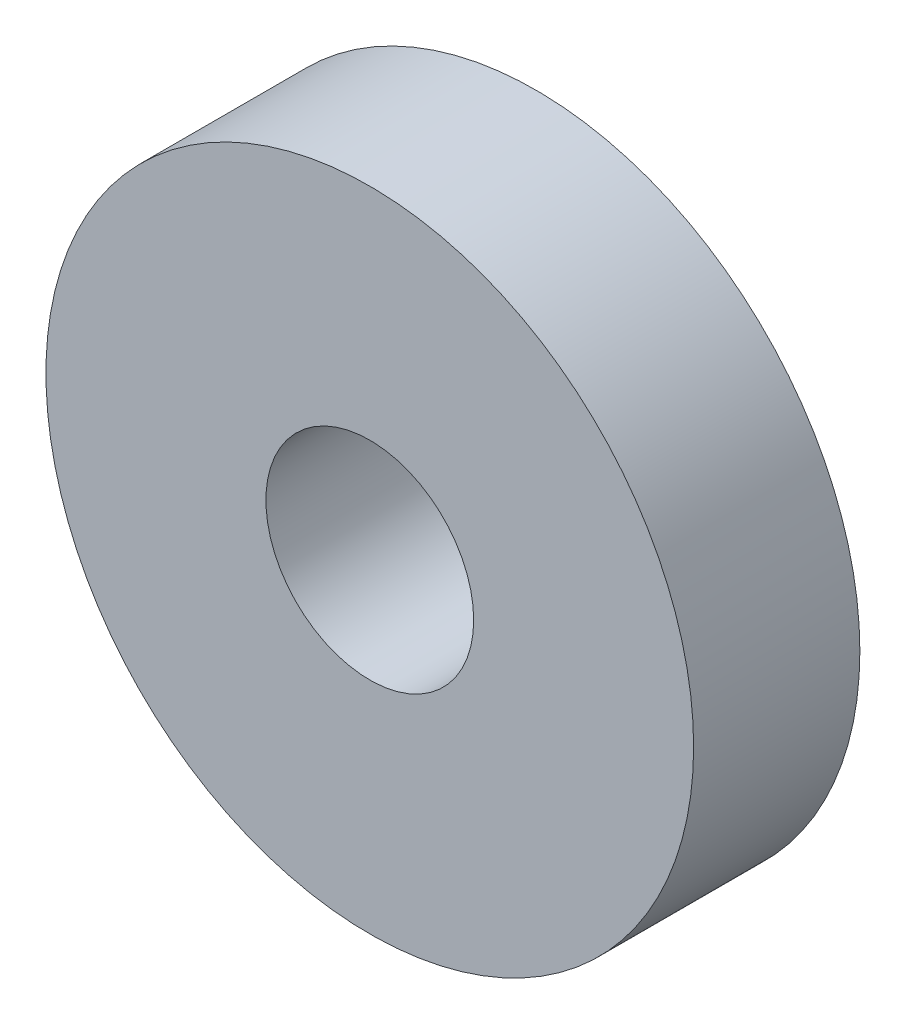
ISO-10303-21;
HEADER;
FILE_DESCRIPTION(('STEP AP214'),'2;1');
FILE_NAME('part.step','',(''),(''),'','','');
FILE_SCHEMA(('AUTOMOTIVE_DESIGN { 1 0 10303 214 1 1 1 1 }'));
ENDSEC;
DATA;
#1=APPLICATION_CONTEXT('core data for automotive mechanical design processes');
#2=APPLICATION_PROTOCOL_DEFINITION('international standard','automotive_design',2000,#1);
#3=PRODUCT_CONTEXT('',#1,'mechanical');
#4=PRODUCT('Part','Part','',(#3));
#5=PRODUCT_RELATED_PRODUCT_CATEGORY('part','',(#4));
#6=PRODUCT_DEFINITION_FORMATION('','',#4);
#7=PRODUCT_DEFINITION_CONTEXT('part definition',#1,'design');
#8=PRODUCT_DEFINITION('design','',#6,#7);
#9=PRODUCT_DEFINITION_SHAPE('','',#8);
#10=(LENGTH_UNIT() NAMED_UNIT(*) SI_UNIT(.MILLI.,.METRE.));
#11=(NAMED_UNIT(*) PLANE_ANGLE_UNIT() SI_UNIT($,.RADIAN.));
#12=(NAMED_UNIT(*) SI_UNIT($,.STERADIAN.) SOLID_ANGLE_UNIT());
#13=UNCERTAINTY_MEASURE_WITH_UNIT(LENGTH_MEASURE(1.E-05),#10,'distance_accuracy_value','');
#14=(GEOMETRIC_REPRESENTATION_CONTEXT(3) GLOBAL_UNCERTAINTY_ASSIGNED_CONTEXT((#13)) GLOBAL_UNIT_ASSIGNED_CONTEXT((#10,
#11,#12)) REPRESENTATION_CONTEXT('',''));
#15=CARTESIAN_POINT('',(0.,0.,0.));
#16=DIRECTION('',(0.,0.,1.));
#17=DIRECTION('',(1.,0.,0.));
#18=AXIS2_PLACEMENT_3D('',#15,#16,#17);
#19=CARTESIAN_POINT('',(0.,0.,20.));
#20=DIRECTION('',(0.,0.,1.));
#21=DIRECTION('',(1.,0.,0.));
#22=AXIS2_PLACEMENT_3D('',#19,#20,#21);
#23=PLANE('',#22);
#24=CARTESIAN_POINT('',(0.,0.,20.));
#25=DIRECTION('',(0.,0.,1.));
#26=DIRECTION('',(1.,0.,0.));
#27=AXIS2_PLACEMENT_3D('',#24,#25,#26);
#28=CIRCLE('',#27,38.9636);
#29=CARTESIAN_POINT('',(38.9636,0.,20.));
#30=VERTEX_POINT('',#29);
#31=EDGE_CURVE('E10',#30,#30,#28,.T.);
#32=ORIENTED_EDGE('',*,*,#31,.T.);
#33=EDGE_LOOP('',(#32));
#34=FACE_BOUND('',#33,.T.);
#35=CARTESIAN_POINT('',(0.,0.,20.));
#36=DIRECTION('',(0.,0.,1.));
#37=DIRECTION('',(1.,0.,0.));
#38=AXIS2_PLACEMENT_3D('',#35,#36,#37);
#39=CIRCLE('',#38,12.5);
#40=CARTESIAN_POINT('',(12.5,0.,20.));
#41=VERTEX_POINT('',#40);
#42=EDGE_CURVE('E41',#41,#41,#39,.T.);
#43=ORIENTED_EDGE('',*,*,#42,.F.);
#44=EDGE_LOOP('',(#43));
#45=FACE_BOUND('',#44,.T.);
#46=ADVANCED_FACE('F30',(#34,#45),#23,.T.);
#47=CARTESIAN_POINT('',(0.,0.,0.));
#48=DIRECTION('',(0.,0.,1.));
#49=DIRECTION('',(1.,0.,0.));
#50=AXIS2_PLACEMENT_3D('',#47,#48,#49);
#51=PLANE('',#50);
#52=CARTESIAN_POINT('',(0.,0.,0.));
#53=DIRECTION('',(0.,0.,1.));
#54=DIRECTION('',(1.,0.,0.));
#55=AXIS2_PLACEMENT_3D('',#52,#53,#54);
#56=CIRCLE('',#55,38.9636);
#57=CARTESIAN_POINT('',(38.9636,0.,0.));
#58=VERTEX_POINT('',#57);
#59=EDGE_CURVE('E34',#58,#58,#56,.T.);
#60=ORIENTED_EDGE('',*,*,#59,.F.);
#61=EDGE_LOOP('',(#60));
#62=FACE_BOUND('',#61,.T.);
#63=CARTESIAN_POINT('',(0.,0.,0.));
#64=DIRECTION('',(0.,0.,1.));
#65=DIRECTION('',(1.,0.,0.));
#66=AXIS2_PLACEMENT_3D('',#63,#64,#65);
#67=CIRCLE('',#66,12.5);
#68=CARTESIAN_POINT('',(12.5,0.,0.));
#69=VERTEX_POINT('',#68);
#70=EDGE_CURVE('E43',#69,#69,#67,.T.);
#71=ORIENTED_EDGE('',*,*,#70,.T.);
#72=EDGE_LOOP('',(#71));
#73=FACE_BOUND('',#72,.T.);
#74=ADVANCED_FACE('F53',(#62,#73),#51,.F.);
#75=CARTESIAN_POINT('',(0.,0.,20.));
#76=DIRECTION('',(0.,0.,-1.));
#77=DIRECTION('',(-1.,0.,0.));
#78=AXIS2_PLACEMENT_3D('',#75,#76,#77);
#79=CYLINDRICAL_SURFACE('',#78,38.9636);
#80=ORIENTED_EDGE('',*,*,#31,.F.);
#81=EDGE_LOOP('',(#80));
#82=FACE_BOUND('',#81,.T.);
#83=ORIENTED_EDGE('',*,*,#59,.T.);
#84=EDGE_LOOP('',(#83));
#85=FACE_BOUND('',#84,.T.);
#86=ADVANCED_FACE('F32',(#82,#85),#79,.T.);
#87=CARTESIAN_POINT('',(0.,0.,20.));
#88=DIRECTION('',(0.,0.,-1.));
#89=DIRECTION('',(-1.,0.,0.));
#90=AXIS2_PLACEMENT_3D('',#87,#88,#89);
#91=CYLINDRICAL_SURFACE('',#90,12.5);
#92=ORIENTED_EDGE('',*,*,#42,.T.);
#93=EDGE_LOOP('',(#92));
#94=FACE_BOUND('',#93,.T.);
#95=ORIENTED_EDGE('',*,*,#70,.F.);
#96=EDGE_LOOP('',(#95));
#97=FACE_BOUND('',#96,.T.);
#98=ADVANCED_FACE('F49',(#94,#97),#91,.F.);
#99=CLOSED_SHELL('',(#46,#74,#86,#98));
#100=MANIFOLD_SOLID_BREP('B2',#99);
#101=ADVANCED_BREP_SHAPE_REPRESENTATION('',(#18,#100),#14);
#102=SHAPE_DEFINITION_REPRESENTATION(#9,#101);
ENDSEC;
END-ISO-10303-21;
